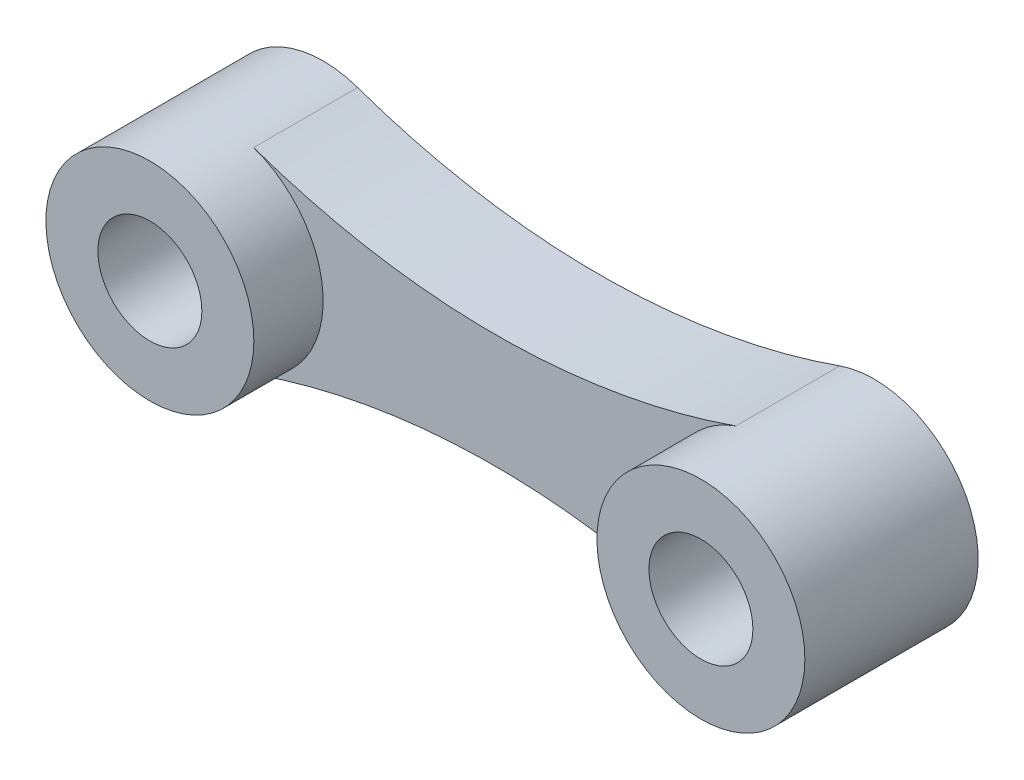
ISO-10303-21;
HEADER;
FILE_DESCRIPTION(('STEP AP214'),'2;1');
FILE_NAME('part.step','',(''),(''),'','','');
FILE_SCHEMA(('AUTOMOTIVE_DESIGN { 1 0 10303 214 1 1 1 1 }'));
ENDSEC;
DATA;
#1=APPLICATION_CONTEXT('core data for automotive mechanical design processes');
#2=APPLICATION_PROTOCOL_DEFINITION('international standard','automotive_design',2000,#1);
#3=PRODUCT_CONTEXT('',#1,'mechanical');
#4=PRODUCT('Part','Part','',(#3));
#5=PRODUCT_RELATED_PRODUCT_CATEGORY('part','',(#4));
#6=PRODUCT_DEFINITION_FORMATION('','',#4);
#7=PRODUCT_DEFINITION_CONTEXT('part definition',#1,'design');
#8=PRODUCT_DEFINITION('design','',#6,#7);
#9=PRODUCT_DEFINITION_SHAPE('','',#8);
#10=(LENGTH_UNIT() NAMED_UNIT(*) SI_UNIT(.MILLI.,.METRE.));
#11=(NAMED_UNIT(*) PLANE_ANGLE_UNIT() SI_UNIT($,.RADIAN.));
#12=(NAMED_UNIT(*) SI_UNIT($,.STERADIAN.) SOLID_ANGLE_UNIT());
#13=UNCERTAINTY_MEASURE_WITH_UNIT(LENGTH_MEASURE(1.E-05),#10,'distance_accuracy_value','');
#14=(GEOMETRIC_REPRESENTATION_CONTEXT(3) GLOBAL_UNCERTAINTY_ASSIGNED_CONTEXT((#13)) GLOBAL_UNIT_ASSIGNED_CONTEXT((#10,
#11,#12)) REPRESENTATION_CONTEXT('',''));
#15=CARTESIAN_POINT('',(0.,0.,0.));
#16=DIRECTION('',(0.,0.,1.));
#17=DIRECTION('',(1.,0.,0.));
#18=AXIS2_PLACEMENT_3D('',#15,#16,#17);
#19=CARTESIAN_POINT('',(-7.95,0.,1.5));
#20=DIRECTION('',(0.,0.,1.));
#21=DIRECTION('',(1.,0.,0.));
#22=AXIS2_PLACEMENT_3D('',#19,#20,#21);
#23=PLANE('',#22);
#24=CARTESIAN_POINT('',(0.,-22.6450325678724,1.5));
#25=DIRECTION('',(0.,0.,-1.));
#26=DIRECTION('',(-1.,0.,0.));
#27=AXIS2_PLACEMENT_3D('',#24,#25,#26);
#28=CIRCLE('',#27,21.);
#29=CARTESIAN_POINT('',(-6.95625,-2.83062907098405,1.5));
#30=VERTEX_POINT('',#29);
#31=CARTESIAN_POINT('',(6.95625,-2.83062907098405,1.5));
#32=VERTEX_POINT('',#31);
#33=EDGE_CURVE('E49',#30,#32,#28,.T.);
#34=ORIENTED_EDGE('',*,*,#33,.T.);
#35=CARTESIAN_POINT('',(7.95,0.,1.5));
#36=DIRECTION('',(0.,0.,1.));
#37=DIRECTION('',(1.,0.,0.));
#38=AXIS2_PLACEMENT_3D('',#35,#36,#37);
#39=CIRCLE('',#38,3.);
#40=CARTESIAN_POINT('',(6.95625,2.83062907098404,1.5));
#41=VERTEX_POINT('',#40);
#42=EDGE_CURVE('E88',#41,#32,#39,.T.);
#43=ORIENTED_EDGE('',*,*,#42,.F.);
#44=CARTESIAN_POINT('',(0.,22.6450325678724,1.5));
#45=DIRECTION('',(0.,0.,-1.));
#46=DIRECTION('',(1.,0.,0.));
#47=AXIS2_PLACEMENT_3D('',#44,#45,#46);
#48=CIRCLE('',#47,21.);
#49=CARTESIAN_POINT('',(-6.95625,2.83062907098405,1.5));
#50=VERTEX_POINT('',#49);
#51=EDGE_CURVE('E73',#41,#50,#48,.T.);
#52=ORIENTED_EDGE('',*,*,#51,.T.);
#53=CARTESIAN_POINT('',(-7.95,0.,1.5));
#54=DIRECTION('',(0.,0.,1.));
#55=DIRECTION('',(1.,0.,0.));
#56=AXIS2_PLACEMENT_3D('',#53,#54,#55);
#57=CIRCLE('',#56,3.);
#58=EDGE_CURVE('E11',#30,#50,#57,.T.);
#59=ORIENTED_EDGE('',*,*,#58,.F.);
#60=EDGE_LOOP('',(#34,#43,#52,#59));
#61=FACE_BOUND('',#60,.T.);
#62=ADVANCED_FACE('F33',(#61),#23,.T.);
#63=CARTESIAN_POINT('',(-7.95,0.,-1.5));
#64=DIRECTION('',(0.,0.,1.));
#65=DIRECTION('',(1.,0.,0.));
#66=AXIS2_PLACEMENT_3D('',#63,#64,#65);
#67=PLANE('',#66);
#68=CARTESIAN_POINT('',(0.,22.6450325678724,-1.5));
#69=DIRECTION('',(0.,0.,1.));
#70=DIRECTION('',(1.,0.,0.));
#71=AXIS2_PLACEMENT_3D('',#68,#69,#70);
#72=CIRCLE('',#71,21.);
#73=CARTESIAN_POINT('',(-6.95625,2.83062907098405,-1.5));
#74=VERTEX_POINT('',#73);
#75=CARTESIAN_POINT('',(6.95625000000001,2.83062907098405,-1.5));
#76=VERTEX_POINT('',#75);
#77=EDGE_CURVE('E81',#74,#76,#72,.T.);
#78=ORIENTED_EDGE('',*,*,#77,.T.);
#79=CARTESIAN_POINT('',(7.95,0.,-1.5));
#80=DIRECTION('',(0.,0.,1.));
#81=DIRECTION('',(1.,0.,0.));
#82=AXIS2_PLACEMENT_3D('',#79,#80,#81);
#83=CIRCLE('',#82,3.);
#84=CARTESIAN_POINT('',(6.95625,-2.83062907098405,-1.5));
#85=VERTEX_POINT('',#84);
#86=EDGE_CURVE('E37',#85,#76,#83,.T.);
#87=ORIENTED_EDGE('',*,*,#86,.F.);
#88=CARTESIAN_POINT('',(0.,-22.6450325678724,-1.5));
#89=DIRECTION('',(0.,0.,1.));
#90=DIRECTION('',(1.,0.,0.));
#91=AXIS2_PLACEMENT_3D('',#88,#89,#90);
#92=CIRCLE('',#91,21.);
#93=CARTESIAN_POINT('',(-6.95625,-2.83062907098405,-1.5));
#94=VERTEX_POINT('',#93);
#95=EDGE_CURVE('E105',#85,#94,#92,.T.);
#96=ORIENTED_EDGE('',*,*,#95,.T.);
#97=CARTESIAN_POINT('',(-7.95,0.,-1.5));
#98=DIRECTION('',(0.,0.,1.));
#99=DIRECTION('',(1.,0.,0.));
#100=AXIS2_PLACEMENT_3D('',#97,#98,#99);
#101=CIRCLE('',#100,3.);
#102=EDGE_CURVE('E119',#74,#94,#101,.T.);
#103=ORIENTED_EDGE('',*,*,#102,.F.);
#104=EDGE_LOOP('',(#78,#87,#96,#103));
#105=FACE_BOUND('',#104,.T.);
#106=CARTESIAN_POINT('',(-7.95,0.,-1.5));
#107=DIRECTION('',(0.,0.,1.));
#108=DIRECTION('',(1.,0.,0.));
#109=AXIS2_PLACEMENT_3D('',#106,#107,#108);
#110=CIRCLE('',#109,1.5);
#111=CARTESIAN_POINT('',(-6.45,0.,-1.5));
#112=VERTEX_POINT('',#111);
#113=EDGE_CURVE('E117',#112,#112,#110,.T.);
#114=ORIENTED_EDGE('',*,*,#113,.T.);
#115=EDGE_LOOP('',(#114));
#116=FACE_BOUND('',#115,.T.);
#117=CARTESIAN_POINT('',(7.95,0.,-1.5));
#118=DIRECTION('',(0.,0.,1.));
#119=DIRECTION('',(1.,0.,0.));
#120=AXIS2_PLACEMENT_3D('',#117,#118,#119);
#121=CIRCLE('',#120,1.5);
#122=CARTESIAN_POINT('',(9.45,0.,-1.5));
#123=VERTEX_POINT('',#122);
#124=EDGE_CURVE('E89',#123,#123,#121,.T.);
#125=ORIENTED_EDGE('',*,*,#124,.T.);
#126=EDGE_LOOP('',(#125));
#127=FACE_BOUND('',#126,.T.);
#128=ADVANCED_FACE('F125',(#105,#116,#127),#67,.F.);
#129=CARTESIAN_POINT('',(-7.95,0.,1.5));
#130=DIRECTION('',(0.,0.,-1.));
#131=DIRECTION('',(-1.,0.,0.));
#132=AXIS2_PLACEMENT_3D('',#129,#130,#131);
#133=CYLINDRICAL_SURFACE('',#132,3.);
#134=ORIENTED_EDGE('',*,*,#102,.T.);
#135=DIRECTION('',(0.,0.,1.));
#136=VECTOR('',#135,1.);
#137=CARTESIAN_POINT('',(-6.95625,-2.83062907098405,-1.501));
#138=LINE('',#137,#136);
#139=EDGE_CURVE('E112',#94,#30,#138,.T.);
#140=ORIENTED_EDGE('',*,*,#139,.T.);
#141=ORIENTED_EDGE('',*,*,#58,.T.);
#142=DIRECTION('',(0.,0.,1.));
#143=VECTOR('',#142,1.);
#144=CARTESIAN_POINT('',(-6.95625,2.83062907098405,-1.501));
#145=LINE('',#144,#143);
#146=EDGE_CURVE('E80',#74,#50,#145,.T.);
#147=ORIENTED_EDGE('',*,*,#146,.F.);
#148=EDGE_LOOP('',(#134,#140,#141,#147));
#149=FACE_BOUND('',#148,.T.);
#150=CARTESIAN_POINT('',(-7.95,0.,3.5));
#151=DIRECTION('',(0.,0.,1.));
#152=DIRECTION('',(1.,0.,0.));
#153=AXIS2_PLACEMENT_3D('',#150,#151,#152);
#154=CIRCLE('',#153,3.);
#155=CARTESIAN_POINT('',(-4.95,0.,3.5));
#156=VERTEX_POINT('',#155);
#157=EDGE_CURVE('E103',#156,#156,#154,.T.);
#158=ORIENTED_EDGE('',*,*,#157,.F.);
#159=EDGE_LOOP('',(#158));
#160=FACE_BOUND('',#159,.T.);
#161=ADVANCED_FACE('F35',(#149,#160),#133,.T.);
#162=CARTESIAN_POINT('',(7.95,0.,1.5));
#163=DIRECTION('',(0.,0.,-1.));
#164=DIRECTION('',(-1.,0.,0.));
#165=AXIS2_PLACEMENT_3D('',#162,#163,#164);
#166=CYLINDRICAL_SURFACE('',#165,3.);
#167=ORIENTED_EDGE('',*,*,#86,.T.);
#168=DIRECTION('',(0.,0.,1.));
#169=VECTOR('',#168,1.);
#170=CARTESIAN_POINT('',(6.95625000000001,2.83062907098405,-1.501));
#171=LINE('',#170,#169);
#172=EDGE_CURVE('E77',#76,#41,#171,.T.);
#173=ORIENTED_EDGE('',*,*,#172,.T.);
#174=ORIENTED_EDGE('',*,*,#42,.T.);
#175=DIRECTION('',(0.,0.,1.));
#176=VECTOR('',#175,1.);
#177=CARTESIAN_POINT('',(6.95625,-2.83062907098405,-1.501));
#178=LINE('',#177,#176);
#179=EDGE_CURVE('E90',#85,#32,#178,.T.);
#180=ORIENTED_EDGE('',*,*,#179,.F.);
#181=EDGE_LOOP('',(#167,#173,#174,#180));
#182=FACE_BOUND('',#181,.T.);
#183=CARTESIAN_POINT('',(7.95,0.,3.5));
#184=DIRECTION('',(0.,0.,1.));
#185=DIRECTION('',(1.,0.,0.));
#186=AXIS2_PLACEMENT_3D('',#183,#184,#185);
#187=CIRCLE('',#186,3.);
#188=CARTESIAN_POINT('',(10.95,0.,3.5));
#189=VERTEX_POINT('',#188);
#190=EDGE_CURVE('E92',#189,#189,#187,.T.);
#191=ORIENTED_EDGE('',*,*,#190,.F.);
#192=EDGE_LOOP('',(#191));
#193=FACE_BOUND('',#192,.T.);
#194=ADVANCED_FACE('F85',(#182,#193),#166,.T.);
#195=CARTESIAN_POINT('',(-7.95,0.,1.5));
#196=DIRECTION('',(0.,0.,-1.));
#197=DIRECTION('',(-1.,0.,0.));
#198=AXIS2_PLACEMENT_3D('',#195,#196,#197);
#199=CYLINDRICAL_SURFACE('',#198,1.5);
#200=ORIENTED_EDGE('',*,*,#113,.F.);
#201=EDGE_LOOP('',(#200));
#202=FACE_BOUND('',#201,.T.);
#203=CARTESIAN_POINT('',(-7.95,0.,3.5));
#204=DIRECTION('',(0.,0.,1.));
#205=DIRECTION('',(1.,0.,0.));
#206=AXIS2_PLACEMENT_3D('',#203,#204,#205);
#207=CIRCLE('',#206,1.5);
#208=CARTESIAN_POINT('',(-6.45,0.,3.5));
#209=VERTEX_POINT('',#208);
#210=EDGE_CURVE('E96',#209,#209,#207,.T.);
#211=ORIENTED_EDGE('',*,*,#210,.T.);
#212=EDGE_LOOP('',(#211));
#213=FACE_BOUND('',#212,.T.);
#214=ADVANCED_FACE('F148',(#202,#213),#199,.F.);
#215=CARTESIAN_POINT('',(7.95,0.,1.5));
#216=DIRECTION('',(0.,0.,-1.));
#217=DIRECTION('',(-1.,0.,0.));
#218=AXIS2_PLACEMENT_3D('',#215,#216,#217);
#219=CYLINDRICAL_SURFACE('',#218,1.5);
#220=ORIENTED_EDGE('',*,*,#124,.F.);
#221=EDGE_LOOP('',(#220));
#222=FACE_BOUND('',#221,.T.);
#223=CARTESIAN_POINT('',(7.95,0.,3.5));
#224=DIRECTION('',(0.,0.,1.));
#225=DIRECTION('',(1.,0.,0.));
#226=AXIS2_PLACEMENT_3D('',#223,#224,#225);
#227=CIRCLE('',#226,1.5);
#228=CARTESIAN_POINT('',(9.45,0.,3.5));
#229=VERTEX_POINT('',#228);
#230=EDGE_CURVE('E93',#229,#229,#227,.T.);
#231=ORIENTED_EDGE('',*,*,#230,.T.);
#232=EDGE_LOOP('',(#231));
#233=FACE_BOUND('',#232,.T.);
#234=ADVANCED_FACE('F139',(#222,#233),#219,.F.);
#235=CARTESIAN_POINT('',(0.,22.6450325678724,-1.501));
#236=DIRECTION('',(0.,0.,1.));
#237=DIRECTION('',(1.,0.,0.));
#238=AXIS2_PLACEMENT_3D('',#235,#236,#237);
#239=CYLINDRICAL_SURFACE('',#238,21.);
#240=ORIENTED_EDGE('',*,*,#77,.F.);
#241=ORIENTED_EDGE('',*,*,#146,.T.);
#242=ORIENTED_EDGE('',*,*,#51,.F.);
#243=ORIENTED_EDGE('',*,*,#172,.F.);
#244=EDGE_LOOP('',(#240,#241,#242,#243));
#245=FACE_BOUND('',#244,.T.);
#246=ADVANCED_FACE('F76',(#245),#239,.F.);
#247=CARTESIAN_POINT('',(0.,-22.6450325678724,-1.501));
#248=DIRECTION('',(0.,0.,1.));
#249=DIRECTION('',(1.,0.,0.));
#250=AXIS2_PLACEMENT_3D('',#247,#248,#249);
#251=CYLINDRICAL_SURFACE('',#250,21.);
#252=ORIENTED_EDGE('',*,*,#95,.F.);
#253=ORIENTED_EDGE('',*,*,#179,.T.);
#254=ORIENTED_EDGE('',*,*,#33,.F.);
#255=ORIENTED_EDGE('',*,*,#139,.F.);
#256=EDGE_LOOP('',(#252,#253,#254,#255));
#257=FACE_BOUND('',#256,.T.);
#258=ADVANCED_FACE('F128',(#257),#251,.F.);
#259=CARTESIAN_POINT('',(-7.95,0.,3.5));
#260=DIRECTION('',(0.,0.,1.));
#261=DIRECTION('',(1.,0.,0.));
#262=AXIS2_PLACEMENT_3D('',#259,#260,#261);
#263=PLANE('',#262);
#264=ORIENTED_EDGE('',*,*,#157,.T.);
#265=EDGE_LOOP('',(#264));
#266=FACE_BOUND('',#265,.T.);
#267=ORIENTED_EDGE('',*,*,#210,.F.);
#268=EDGE_LOOP('',(#267));
#269=FACE_BOUND('',#268,.T.);
#270=ADVANCED_FACE('F130',(#266,#269),#263,.T.);
#271=CARTESIAN_POINT('',(7.95,0.,3.5));
#272=DIRECTION('',(0.,0.,1.));
#273=DIRECTION('',(1.,0.,0.));
#274=AXIS2_PLACEMENT_3D('',#271,#272,#273);
#275=PLANE('',#274);
#276=ORIENTED_EDGE('',*,*,#190,.T.);
#277=EDGE_LOOP('',(#276));
#278=FACE_BOUND('',#277,.T.);
#279=ORIENTED_EDGE('',*,*,#230,.F.);
#280=EDGE_LOOP('',(#279));
#281=FACE_BOUND('',#280,.T.);
#282=ADVANCED_FACE('F136',(#278,#281),#275,.T.);
#283=CLOSED_SHELL('',(#62,#128,#161,#194,#214,#234,#246,#258,#270,#282));
#284=MANIFOLD_SOLID_BREP('B2',#283);
#285=ADVANCED_BREP_SHAPE_REPRESENTATION('',(#18,#284),#14);
#286=SHAPE_DEFINITION_REPRESENTATION(#9,#285);
ENDSEC;
END-ISO-10303-21;
